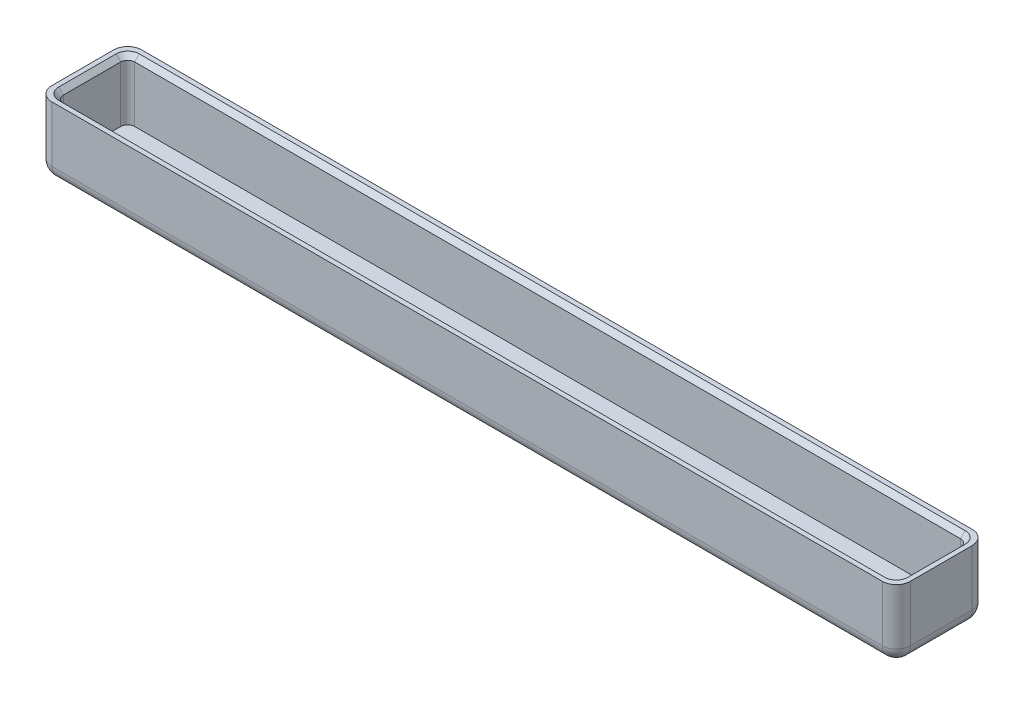
ISO-10303-21;
HEADER;
FILE_DESCRIPTION(('STEP AP214'),'2;1');
FILE_NAME('part.step','',(''),(''),'','','');
FILE_SCHEMA(('AUTOMOTIVE_DESIGN { 1 0 10303 214 1 1 1 1 }'));
ENDSEC;
DATA;
#1=APPLICATION_CONTEXT('core data for automotive mechanical design processes');
#2=APPLICATION_PROTOCOL_DEFINITION('international standard','automotive_design',2000,#1);
#3=PRODUCT_CONTEXT('',#1,'mechanical');
#4=PRODUCT('Part','Part','',(#3));
#5=PRODUCT_RELATED_PRODUCT_CATEGORY('part','',(#4));
#6=PRODUCT_DEFINITION_FORMATION('','',#4);
#7=PRODUCT_DEFINITION_CONTEXT('part definition',#1,'design');
#8=PRODUCT_DEFINITION('design','',#6,#7);
#9=PRODUCT_DEFINITION_SHAPE('','',#8);
#10=(LENGTH_UNIT() NAMED_UNIT(*) SI_UNIT(.MILLI.,.METRE.));
#11=(NAMED_UNIT(*) PLANE_ANGLE_UNIT() SI_UNIT($,.RADIAN.));
#12=(NAMED_UNIT(*) SI_UNIT($,.STERADIAN.) SOLID_ANGLE_UNIT());
#13=UNCERTAINTY_MEASURE_WITH_UNIT(LENGTH_MEASURE(1.E-05),#10,'distance_accuracy_value','');
#14=(GEOMETRIC_REPRESENTATION_CONTEXT(3) GLOBAL_UNCERTAINTY_ASSIGNED_CONTEXT((#13)) GLOBAL_UNIT_ASSIGNED_CONTEXT((#10,
#11,#12)) REPRESENTATION_CONTEXT('',''));
#15=CARTESIAN_POINT('',(0.,0.,0.));
#16=DIRECTION('',(0.,0.,1.));
#17=DIRECTION('',(1.,0.,0.));
#18=AXIS2_PLACEMENT_3D('',#15,#16,#17);
#19=CARTESIAN_POINT('',(0.,15.,0.));
#20=DIRECTION('',(0.,-1.,0.));
#21=DIRECTION('',(0.,0.,-1.));
#22=AXIS2_PLACEMENT_3D('',#19,#20,#21);
#23=PLANE('',#22);
#24=CARTESIAN_POINT('',(88.65,15.,-6.15));
#25=DIRECTION('',(0.,-1.,0.));
#26=DIRECTION('',(0.,0.,-1.));
#27=AXIS2_PLACEMENT_3D('',#24,#25,#26);
#28=CIRCLE('',#27,2.5);
#29=CARTESIAN_POINT('',(88.65,15.,-8.65));
#30=VERTEX_POINT('',#29);
#31=CARTESIAN_POINT('',(91.15,15.,-6.15));
#32=VERTEX_POINT('',#31);
#33=EDGE_CURVE('E327',#30,#32,#28,.T.);
#34=ORIENTED_EDGE('',*,*,#33,.T.);
#35=DIRECTION('',(0.,0.,1.));
#36=VECTOR('',#35,1.);
#37=CARTESIAN_POINT('',(91.15,15.,6.15));
#38=LINE('',#37,#36);
#39=CARTESIAN_POINT('',(91.15,15.,6.15));
#40=VERTEX_POINT('',#39);
#41=EDGE_CURVE('E329',#32,#40,#38,.T.);
#42=ORIENTED_EDGE('',*,*,#41,.T.);
#43=CARTESIAN_POINT('',(88.65,15.,6.15));
#44=DIRECTION('',(0.,-1.,0.));
#45=DIRECTION('',(0.,0.,-1.));
#46=AXIS2_PLACEMENT_3D('',#43,#44,#45);
#47=CIRCLE('',#46,2.5);
#48=CARTESIAN_POINT('',(88.65,15.,8.65));
#49=VERTEX_POINT('',#48);
#50=EDGE_CURVE('E325',#40,#49,#47,.T.);
#51=ORIENTED_EDGE('',*,*,#50,.T.);
#52=DIRECTION('',(-1.,0.,0.));
#53=VECTOR('',#52,1.);
#54=CARTESIAN_POINT('',(-88.65,15.,8.65));
#55=LINE('',#54,#53);
#56=CARTESIAN_POINT('',(-88.65,15.,8.65));
#57=VERTEX_POINT('',#56);
#58=EDGE_CURVE('E321',#49,#57,#55,.T.);
#59=ORIENTED_EDGE('',*,*,#58,.T.);
#60=CARTESIAN_POINT('',(-88.65,15.,6.15));
#61=DIRECTION('',(0.,-1.,0.));
#62=DIRECTION('',(0.,0.,-1.));
#63=AXIS2_PLACEMENT_3D('',#60,#61,#62);
#64=CIRCLE('',#63,2.5);
#65=CARTESIAN_POINT('',(-91.15,15.,6.15));
#66=VERTEX_POINT('',#65);
#67=EDGE_CURVE('E317',#57,#66,#64,.T.);
#68=ORIENTED_EDGE('',*,*,#67,.T.);
#69=DIRECTION('',(0.,0.,-1.));
#70=VECTOR('',#69,1.);
#71=CARTESIAN_POINT('',(-91.15,15.,-6.15));
#72=LINE('',#71,#70);
#73=CARTESIAN_POINT('',(-91.15,15.,-6.15));
#74=VERTEX_POINT('',#73);
#75=EDGE_CURVE('E315',#66,#74,#72,.T.);
#76=ORIENTED_EDGE('',*,*,#75,.T.);
#77=CARTESIAN_POINT('',(-88.65,15.,-6.15));
#78=DIRECTION('',(0.,-1.,0.));
#79=DIRECTION('',(0.,0.,-1.));
#80=AXIS2_PLACEMENT_3D('',#77,#78,#79);
#81=CIRCLE('',#80,2.5);
#82=CARTESIAN_POINT('',(-88.65,15.,-8.65));
#83=VERTEX_POINT('',#82);
#84=EDGE_CURVE('E319',#74,#83,#81,.T.);
#85=ORIENTED_EDGE('',*,*,#84,.T.);
#86=DIRECTION('',(1.,0.,0.));
#87=VECTOR('',#86,1.);
#88=CARTESIAN_POINT('',(88.65,15.,-8.65));
#89=LINE('',#88,#87);
#90=EDGE_CURVE('E323',#83,#30,#89,.T.);
#91=ORIENTED_EDGE('',*,*,#90,.T.);
#92=EDGE_LOOP('',(#34,#42,#51,#59,#68,#76,#85,#91));
#93=FACE_BOUND('',#92,.T.);
#94=DIRECTION('',(1.,0.,0.));
#95=VECTOR('',#94,1.);
#96=CARTESIAN_POINT('',(-92.15,15.,9.65));
#97=LINE('',#96,#95);
#98=CARTESIAN_POINT('',(-89.15,15.,9.65));
#99=VERTEX_POINT('',#98);
#100=CARTESIAN_POINT('',(89.1499999999999,15.,9.65));
#101=VERTEX_POINT('',#100);
#102=EDGE_CURVE('E410',#99,#101,#97,.T.);
#103=ORIENTED_EDGE('',*,*,#102,.T.);
#104=CARTESIAN_POINT('',(89.15,15.,6.65));
#105=DIRECTION('',(0.,-1.,0.));
#106=DIRECTION('',(0.,0.,-1.));
#107=AXIS2_PLACEMENT_3D('',#104,#105,#106);
#108=CIRCLE('',#107,3.);
#109=CARTESIAN_POINT('',(92.15,15.,6.65));
#110=VERTEX_POINT('',#109);
#111=EDGE_CURVE('E200',#101,#110,#108,.F.);
#112=ORIENTED_EDGE('',*,*,#111,.T.);
#113=DIRECTION('',(0.,0.,-1.));
#114=VECTOR('',#113,1.);
#115=CARTESIAN_POINT('',(92.15,15.,9.65));
#116=LINE('',#115,#114);
#117=CARTESIAN_POINT('',(92.15,15.,-6.65));
#118=VERTEX_POINT('',#117);
#119=EDGE_CURVE('E196',#110,#118,#116,.T.);
#120=ORIENTED_EDGE('',*,*,#119,.T.);
#121=CARTESIAN_POINT('',(89.15,15.,-6.65));
#122=DIRECTION('',(0.,-1.,0.));
#123=DIRECTION('',(0.,0.,-1.));
#124=AXIS2_PLACEMENT_3D('',#121,#122,#123);
#125=CIRCLE('',#124,3.);
#126=CARTESIAN_POINT('',(89.1499999999999,15.,-9.65));
#127=VERTEX_POINT('',#126);
#128=EDGE_CURVE('E190',#118,#127,#125,.F.);
#129=ORIENTED_EDGE('',*,*,#128,.T.);
#130=DIRECTION('',(-1.,0.,0.));
#131=VECTOR('',#130,1.);
#132=CARTESIAN_POINT('',(-92.15,15.,-9.65));
#133=LINE('',#132,#131);
#134=CARTESIAN_POINT('',(-89.15,15.,-9.65));
#135=VERTEX_POINT('',#134);
#136=EDGE_CURVE('E193',#127,#135,#133,.T.);
#137=ORIENTED_EDGE('',*,*,#136,.T.);
#138=CARTESIAN_POINT('',(-89.15,15.,-6.65));
#139=DIRECTION('',(0.,-1.,0.));
#140=DIRECTION('',(0.,0.,-1.));
#141=AXIS2_PLACEMENT_3D('',#138,#139,#140);
#142=CIRCLE('',#141,3.);
#143=CARTESIAN_POINT('',(-92.15,15.,-6.65));
#144=VERTEX_POINT('',#143);
#145=EDGE_CURVE('E201',#135,#144,#142,.F.);
#146=ORIENTED_EDGE('',*,*,#145,.T.);
#147=DIRECTION('',(0.,0.,1.));
#148=VECTOR('',#147,1.);
#149=CARTESIAN_POINT('',(-92.15,15.,9.65));
#150=LINE('',#149,#148);
#151=CARTESIAN_POINT('',(-92.15,15.,6.65));
#152=VERTEX_POINT('',#151);
#153=EDGE_CURVE('E210',#144,#152,#150,.T.);
#154=ORIENTED_EDGE('',*,*,#153,.T.);
#155=CARTESIAN_POINT('',(-89.15,15.,6.65));
#156=DIRECTION('',(0.,-1.,0.));
#157=DIRECTION('',(0.,0.,-1.));
#158=AXIS2_PLACEMENT_3D('',#155,#156,#157);
#159=CIRCLE('',#158,3.);
#160=EDGE_CURVE('E248',#152,#99,#159,.F.);
#161=ORIENTED_EDGE('',*,*,#160,.T.);
#162=EDGE_LOOP('',(#103,#112,#120,#129,#137,#146,#154,#161));
#163=FACE_BOUND('',#162,.T.);
#164=ADVANCED_FACE('F37',(#93,#163),#23,.F.);
#165=CARTESIAN_POINT('',(92.15,15.,9.65));
#166=DIRECTION('',(-1.,0.,0.));
#167=DIRECTION('',(0.,0.,1.));
#168=AXIS2_PLACEMENT_3D('',#165,#166,#167);
#169=PLANE('',#168);
#170=ORIENTED_EDGE('',*,*,#119,.F.);
#171=DIRECTION('',(0.,-1.,0.));
#172=VECTOR('',#171,1.);
#173=CARTESIAN_POINT('',(92.15,15.,6.65));
#174=LINE('',#173,#172);
#175=CARTESIAN_POINT('',(92.15,3.,6.65));
#176=VERTEX_POINT('',#175);
#177=EDGE_CURVE('E246',#110,#176,#174,.T.);
#178=ORIENTED_EDGE('',*,*,#177,.T.);
#179=DIRECTION('',(0.,0.,-1.));
#180=VECTOR('',#179,1.);
#181=CARTESIAN_POINT('',(92.15,3.,-9.65));
#182=LINE('',#181,#180);
#183=CARTESIAN_POINT('',(92.15,3.,-6.65));
#184=VERTEX_POINT('',#183);
#185=EDGE_CURVE('E244',#176,#184,#182,.T.);
#186=ORIENTED_EDGE('',*,*,#185,.T.);
#187=DIRECTION('',(0.,-1.,0.));
#188=VECTOR('',#187,1.);
#189=CARTESIAN_POINT('',(92.15,15.,-6.65));
#190=LINE('',#189,#188);
#191=EDGE_CURVE('E242',#184,#118,#190,.F.);
#192=ORIENTED_EDGE('',*,*,#191,.T.);
#193=EDGE_LOOP('',(#170,#178,#186,#192));
#194=FACE_BOUND('',#193,.T.);
#195=ADVANCED_FACE('F424',(#194),#169,.F.);
#196=CARTESIAN_POINT('',(-92.15,15.,-9.65));
#197=DIRECTION('',(0.,0.,1.));
#198=DIRECTION('',(1.,0.,0.));
#199=AXIS2_PLACEMENT_3D('',#196,#197,#198);
#200=PLANE('',#199);
#201=ORIENTED_EDGE('',*,*,#136,.F.);
#202=DIRECTION('',(0.,-1.,0.));
#203=VECTOR('',#202,1.);
#204=CARTESIAN_POINT('',(89.15,15.,-9.65));
#205=LINE('',#204,#203);
#206=CARTESIAN_POINT('',(89.15,3.,-9.65));
#207=VERTEX_POINT('',#206);
#208=EDGE_CURVE('E206',#127,#207,#205,.T.);
#209=ORIENTED_EDGE('',*,*,#208,.T.);
#210=DIRECTION('',(-1.,0.,0.));
#211=VECTOR('',#210,1.);
#212=CARTESIAN_POINT('',(-92.15,3.,-9.65));
#213=LINE('',#212,#211);
#214=CARTESIAN_POINT('',(-89.15,3.,-9.65));
#215=VERTEX_POINT('',#214);
#216=EDGE_CURVE('E217',#207,#215,#213,.T.);
#217=ORIENTED_EDGE('',*,*,#216,.T.);
#218=DIRECTION('',(0.,-1.,0.));
#219=VECTOR('',#218,1.);
#220=CARTESIAN_POINT('',(-89.15,15.,-9.65));
#221=LINE('',#220,#219);
#222=EDGE_CURVE('E209',#215,#135,#221,.F.);
#223=ORIENTED_EDGE('',*,*,#222,.T.);
#224=EDGE_LOOP('',(#201,#209,#217,#223));
#225=FACE_BOUND('',#224,.T.);
#226=ADVANCED_FACE('F204',(#225),#200,.F.);
#227=CARTESIAN_POINT('',(-92.15,15.,9.65));
#228=DIRECTION('',(1.,0.,0.));
#229=DIRECTION('',(0.,0.,-1.));
#230=AXIS2_PLACEMENT_3D('',#227,#228,#229);
#231=PLANE('',#230);
#232=ORIENTED_EDGE('',*,*,#153,.F.);
#233=DIRECTION('',(0.,-1.,0.));
#234=VECTOR('',#233,1.);
#235=CARTESIAN_POINT('',(-92.15,15.,-6.65));
#236=LINE('',#235,#234);
#237=CARTESIAN_POINT('',(-92.15,3.,-6.65));
#238=VERTEX_POINT('',#237);
#239=EDGE_CURVE('E234',#144,#238,#236,.T.);
#240=ORIENTED_EDGE('',*,*,#239,.T.);
#241=DIRECTION('',(0.,0.,1.));
#242=VECTOR('',#241,1.);
#243=CARTESIAN_POINT('',(-92.15,3.,9.65));
#244=LINE('',#243,#242);
#245=CARTESIAN_POINT('',(-92.15,3.,6.65));
#246=VERTEX_POINT('',#245);
#247=EDGE_CURVE('E232',#238,#246,#244,.T.);
#248=ORIENTED_EDGE('',*,*,#247,.T.);
#249=DIRECTION('',(0.,-1.,0.));
#250=VECTOR('',#249,1.);
#251=CARTESIAN_POINT('',(-92.15,15.,6.65));
#252=LINE('',#251,#250);
#253=EDGE_CURVE('E230',#246,#152,#252,.F.);
#254=ORIENTED_EDGE('',*,*,#253,.T.);
#255=EDGE_LOOP('',(#232,#240,#248,#254));
#256=FACE_BOUND('',#255,.T.);
#257=ADVANCED_FACE('F446',(#256),#231,.F.);
#258=CARTESIAN_POINT('',(-92.15,15.,9.65));
#259=DIRECTION('',(0.,0.,-1.));
#260=DIRECTION('',(-1.,0.,0.));
#261=AXIS2_PLACEMENT_3D('',#258,#259,#260);
#262=PLANE('',#261);
#263=DIRECTION('',(1.,0.,0.));
#264=VECTOR('',#263,1.);
#265=CARTESIAN_POINT('',(92.15,3.,9.65));
#266=LINE('',#265,#264);
#267=CARTESIAN_POINT('',(-89.15,3.,9.65));
#268=VERTEX_POINT('',#267);
#269=CARTESIAN_POINT('',(89.15,3.,9.65));
#270=VERTEX_POINT('',#269);
#271=EDGE_CURVE('E238',#268,#270,#266,.T.);
#272=ORIENTED_EDGE('',*,*,#271,.T.);
#273=DIRECTION('',(0.,-1.,0.));
#274=VECTOR('',#273,1.);
#275=CARTESIAN_POINT('',(89.15,15.,9.65));
#276=LINE('',#275,#274);
#277=EDGE_CURVE('E240',#270,#101,#276,.F.);
#278=ORIENTED_EDGE('',*,*,#277,.T.);
#279=ORIENTED_EDGE('',*,*,#102,.F.);
#280=DIRECTION('',(0.,-1.,0.));
#281=VECTOR('',#280,1.);
#282=CARTESIAN_POINT('',(-89.15,15.,9.65));
#283=LINE('',#282,#281);
#284=EDGE_CURVE('E236',#99,#268,#283,.T.);
#285=ORIENTED_EDGE('',*,*,#284,.T.);
#286=EDGE_LOOP('',(#272,#278,#279,#285));
#287=FACE_BOUND('',#286,.T.);
#288=ADVANCED_FACE('F465',(#287),#262,.F.);
#289=CARTESIAN_POINT('',(0.,0.,0.));
#290=DIRECTION('',(0.,-1.,0.));
#291=DIRECTION('',(0.,0.,-1.));
#292=AXIS2_PLACEMENT_3D('',#289,#290,#291);
#293=PLANE('',#292);
#294=DIRECTION('',(0.,0.,1.));
#295=VECTOR('',#294,1.);
#296=CARTESIAN_POINT('',(-89.15,0.,-9.65));
#297=LINE('',#296,#295);
#298=CARTESIAN_POINT('',(-89.15,0.,6.65));
#299=VERTEX_POINT('',#298);
#300=CARTESIAN_POINT('',(-89.15,0.,-6.65));
#301=VERTEX_POINT('',#300);
#302=EDGE_CURVE('E225',#299,#301,#297,.F.);
#303=ORIENTED_EDGE('',*,*,#302,.T.);
#304=DIRECTION('',(-1.,0.,0.));
#305=VECTOR('',#304,1.);
#306=CARTESIAN_POINT('',(92.15,0.,-6.65));
#307=LINE('',#306,#305);
#308=CARTESIAN_POINT('',(89.15,0.,-6.65));
#309=VERTEX_POINT('',#308);
#310=EDGE_CURVE('E227',#301,#309,#307,.F.);
#311=ORIENTED_EDGE('',*,*,#310,.T.);
#312=DIRECTION('',(0.,0.,-1.));
#313=VECTOR('',#312,1.);
#314=CARTESIAN_POINT('',(89.15,0.,9.65));
#315=LINE('',#314,#313);
#316=CARTESIAN_POINT('',(89.15,0.,6.65));
#317=VERTEX_POINT('',#316);
#318=EDGE_CURVE('E216',#309,#317,#315,.F.);
#319=ORIENTED_EDGE('',*,*,#318,.T.);
#320=DIRECTION('',(1.,0.,0.));
#321=VECTOR('',#320,1.);
#322=CARTESIAN_POINT('',(-92.15,0.,6.65));
#323=LINE('',#322,#321);
#324=EDGE_CURVE('E219',#317,#299,#323,.F.);
#325=ORIENTED_EDGE('',*,*,#324,.T.);
#326=EDGE_LOOP('',(#303,#311,#319,#325));
#327=FACE_BOUND('',#326,.T.);
#328=ADVANCED_FACE('F460',(#327),#293,.T.);
#329=CARTESIAN_POINT('',(90.15,15.,9.65));
#330=DIRECTION('',(-1.,0.,0.));
#331=DIRECTION('',(0.,0.,1.));
#332=AXIS2_PLACEMENT_3D('',#329,#330,#331);
#333=PLANE('',#332);
#334=DIRECTION('',(0.,-1.,0.));
#335=VECTOR('',#334,1.);
#336=CARTESIAN_POINT('',(90.15,15.,6.15));
#337=LINE('',#336,#335);
#338=CARTESIAN_POINT('',(90.15,2.,6.15));
#339=VERTEX_POINT('',#338);
#340=CARTESIAN_POINT('',(90.15,14.,6.15));
#341=VERTEX_POINT('',#340);
#342=EDGE_CURVE('E300',#339,#341,#337,.F.);
#343=ORIENTED_EDGE('',*,*,#342,.T.);
#344=DIRECTION('',(0.,0.,-1.));
#345=VECTOR('',#344,1.);
#346=CARTESIAN_POINT('',(90.15,14.,-6.15));
#347=LINE('',#346,#345);
#348=CARTESIAN_POINT('',(90.15,14.,-6.15));
#349=VERTEX_POINT('',#348);
#350=EDGE_CURVE('E312',#341,#349,#347,.T.);
#351=ORIENTED_EDGE('',*,*,#350,.T.);
#352=DIRECTION('',(0.,-1.,0.));
#353=VECTOR('',#352,1.);
#354=CARTESIAN_POINT('',(90.15,2.,-6.15));
#355=LINE('',#354,#353);
#356=CARTESIAN_POINT('',(90.15,2.,-6.15));
#357=VERTEX_POINT('',#356);
#358=EDGE_CURVE('E298',#349,#357,#355,.T.);
#359=ORIENTED_EDGE('',*,*,#358,.T.);
#360=DIRECTION('',(0.,0.,-1.));
#361=VECTOR('',#360,1.);
#362=CARTESIAN_POINT('',(90.15,2.,0.));
#363=LINE('',#362,#361);
#364=EDGE_CURVE('E285',#339,#357,#363,.T.);
#365=ORIENTED_EDGE('',*,*,#364,.F.);
#366=EDGE_LOOP('',(#343,#351,#359,#365));
#367=FACE_BOUND('',#366,.T.);
#368=ADVANCED_FACE('F391',(#367),#333,.T.);
#369=CARTESIAN_POINT('',(-92.15,15.,-7.65));
#370=DIRECTION('',(0.,0.,1.));
#371=DIRECTION('',(1.,0.,0.));
#372=AXIS2_PLACEMENT_3D('',#369,#370,#371);
#373=PLANE('',#372);
#374=DIRECTION('',(0.,-1.,0.));
#375=VECTOR('',#374,1.);
#376=CARTESIAN_POINT('',(88.65,15.,-7.65));
#377=LINE('',#376,#375);
#378=CARTESIAN_POINT('',(88.65,2.,-7.65));
#379=VERTEX_POINT('',#378);
#380=CARTESIAN_POINT('',(88.65,14.,-7.65));
#381=VERTEX_POINT('',#380);
#382=EDGE_CURVE('E305',#379,#381,#377,.F.);
#383=ORIENTED_EDGE('',*,*,#382,.T.);
#384=DIRECTION('',(-1.,0.,0.));
#385=VECTOR('',#384,1.);
#386=CARTESIAN_POINT('',(-88.65,14.,-7.65));
#387=LINE('',#386,#385);
#388=CARTESIAN_POINT('',(-88.65,14.,-7.65));
#389=VERTEX_POINT('',#388);
#390=EDGE_CURVE('E336',#381,#389,#387,.T.);
#391=ORIENTED_EDGE('',*,*,#390,.T.);
#392=DIRECTION('',(0.,-1.,0.));
#393=VECTOR('',#392,1.);
#394=CARTESIAN_POINT('',(-88.65,2.,-7.65));
#395=LINE('',#394,#393);
#396=CARTESIAN_POINT('',(-88.65,2.,-7.65));
#397=VERTEX_POINT('',#396);
#398=EDGE_CURVE('E303',#389,#397,#395,.T.);
#399=ORIENTED_EDGE('',*,*,#398,.T.);
#400=DIRECTION('',(-1.,0.,0.));
#401=VECTOR('',#400,1.);
#402=CARTESIAN_POINT('',(0.,2.,-7.65));
#403=LINE('',#402,#401);
#404=EDGE_CURVE('E396',#379,#397,#403,.T.);
#405=ORIENTED_EDGE('',*,*,#404,.F.);
#406=EDGE_LOOP('',(#383,#391,#399,#405));
#407=FACE_BOUND('',#406,.T.);
#408=ADVANCED_FACE('F493',(#407),#373,.T.);
#409=CARTESIAN_POINT('',(-90.15,15.,9.65));
#410=DIRECTION('',(1.,0.,0.));
#411=DIRECTION('',(0.,0.,-1.));
#412=AXIS2_PLACEMENT_3D('',#409,#410,#411);
#413=PLANE('',#412);
#414=DIRECTION('',(0.,-1.,0.));
#415=VECTOR('',#414,1.);
#416=CARTESIAN_POINT('',(-90.15,15.,-6.15));
#417=LINE('',#416,#415);
#418=CARTESIAN_POINT('',(-90.15,2.,-6.15));
#419=VERTEX_POINT('',#418);
#420=CARTESIAN_POINT('',(-90.15,14.,-6.15));
#421=VERTEX_POINT('',#420);
#422=EDGE_CURVE('E308',#419,#421,#417,.F.);
#423=ORIENTED_EDGE('',*,*,#422,.T.);
#424=DIRECTION('',(0.,0.,1.));
#425=VECTOR('',#424,1.);
#426=CARTESIAN_POINT('',(-90.15,14.,6.15));
#427=LINE('',#426,#425);
#428=CARTESIAN_POINT('',(-90.15,14.,6.15));
#429=VERTEX_POINT('',#428);
#430=EDGE_CURVE('E11',#421,#429,#427,.T.);
#431=ORIENTED_EDGE('',*,*,#430,.T.);
#432=DIRECTION('',(0.,-1.,0.));
#433=VECTOR('',#432,1.);
#434=CARTESIAN_POINT('',(-90.15,2.,6.15));
#435=LINE('',#434,#433);
#436=CARTESIAN_POINT('',(-90.15,2.,6.15));
#437=VERTEX_POINT('',#436);
#438=EDGE_CURVE('E310',#429,#437,#435,.T.);
#439=ORIENTED_EDGE('',*,*,#438,.T.);
#440=DIRECTION('',(0.,0.,1.));
#441=VECTOR('',#440,1.);
#442=CARTESIAN_POINT('',(-90.15,2.,0.));
#443=LINE('',#442,#441);
#444=EDGE_CURVE('E399',#419,#437,#443,.T.);
#445=ORIENTED_EDGE('',*,*,#444,.F.);
#446=EDGE_LOOP('',(#423,#431,#439,#445));
#447=FACE_BOUND('',#446,.T.);
#448=ADVANCED_FACE('F489',(#447),#413,.T.);
#449=CARTESIAN_POINT('',(-92.15,15.,7.65));
#450=DIRECTION('',(0.,0.,-1.));
#451=DIRECTION('',(-1.,0.,0.));
#452=AXIS2_PLACEMENT_3D('',#449,#450,#451);
#453=PLANE('',#452);
#454=DIRECTION('',(0.,-1.,0.));
#455=VECTOR('',#454,1.);
#456=CARTESIAN_POINT('',(-88.65,15.,7.65));
#457=LINE('',#456,#455);
#458=CARTESIAN_POINT('',(-88.65,2.,7.65));
#459=VERTEX_POINT('',#458);
#460=CARTESIAN_POINT('',(-88.65,14.,7.65));
#461=VERTEX_POINT('',#460);
#462=EDGE_CURVE('E252',#459,#461,#457,.F.);
#463=ORIENTED_EDGE('',*,*,#462,.T.);
#464=DIRECTION('',(1.,0.,0.));
#465=VECTOR('',#464,1.);
#466=CARTESIAN_POINT('',(88.65,14.,7.65));
#467=LINE('',#466,#465);
#468=CARTESIAN_POINT('',(88.65,14.,7.65));
#469=VERTEX_POINT('',#468);
#470=EDGE_CURVE('E338',#461,#469,#467,.T.);
#471=ORIENTED_EDGE('',*,*,#470,.T.);
#472=DIRECTION('',(0.,-1.,0.));
#473=VECTOR('',#472,1.);
#474=CARTESIAN_POINT('',(88.65,2.,7.65));
#475=LINE('',#474,#473);
#476=CARTESIAN_POINT('',(88.65,2.,7.65));
#477=VERTEX_POINT('',#476);
#478=EDGE_CURVE('E288',#469,#477,#475,.T.);
#479=ORIENTED_EDGE('',*,*,#478,.T.);
#480=DIRECTION('',(1.,0.,0.));
#481=VECTOR('',#480,1.);
#482=CARTESIAN_POINT('',(0.,2.,7.65));
#483=LINE('',#482,#481);
#484=EDGE_CURVE('E404',#459,#477,#483,.T.);
#485=ORIENTED_EDGE('',*,*,#484,.F.);
#486=EDGE_LOOP('',(#463,#471,#479,#485));
#487=FACE_BOUND('',#486,.T.);
#488=ADVANCED_FACE('F486',(#487),#453,.T.);
#489=CARTESIAN_POINT('',(0.,2.,0.));
#490=DIRECTION('',(0.,-1.,0.));
#491=DIRECTION('',(0.,0.,-1.));
#492=AXIS2_PLACEMENT_3D('',#489,#490,#491);
#493=PLANE('',#492);
#494=ORIENTED_EDGE('',*,*,#484,.T.);
#495=CARTESIAN_POINT('',(88.65,2.,6.15));
#496=DIRECTION('',(0.,-1.,0.));
#497=DIRECTION('',(0.,0.,-1.));
#498=AXIS2_PLACEMENT_3D('',#495,#496,#497);
#499=CIRCLE('',#498,1.5);
#500=EDGE_CURVE('E296',#477,#339,#499,.F.);
#501=ORIENTED_EDGE('',*,*,#500,.T.);
#502=ORIENTED_EDGE('',*,*,#364,.T.);
#503=CARTESIAN_POINT('',(88.65,2.,-6.15));
#504=DIRECTION('',(0.,-1.,0.));
#505=DIRECTION('',(0.,0.,-1.));
#506=AXIS2_PLACEMENT_3D('',#503,#504,#505);
#507=CIRCLE('',#506,1.5);
#508=EDGE_CURVE('E294',#357,#379,#507,.F.);
#509=ORIENTED_EDGE('',*,*,#508,.T.);
#510=ORIENTED_EDGE('',*,*,#404,.T.);
#511=CARTESIAN_POINT('',(-88.65,2.,-6.15));
#512=DIRECTION('',(0.,-1.,0.));
#513=DIRECTION('',(0.,0.,-1.));
#514=AXIS2_PLACEMENT_3D('',#511,#512,#513);
#515=CIRCLE('',#514,1.5);
#516=EDGE_CURVE('E290',#397,#419,#515,.F.);
#517=ORIENTED_EDGE('',*,*,#516,.T.);
#518=ORIENTED_EDGE('',*,*,#444,.T.);
#519=CARTESIAN_POINT('',(-88.65,2.,6.15));
#520=DIRECTION('',(0.,-1.,0.));
#521=DIRECTION('',(0.,0.,-1.));
#522=AXIS2_PLACEMENT_3D('',#519,#520,#521);
#523=CIRCLE('',#522,1.5);
#524=EDGE_CURVE('E292',#437,#459,#523,.F.);
#525=ORIENTED_EDGE('',*,*,#524,.T.);
#526=EDGE_LOOP('',(#494,#501,#502,#509,#510,#517,#518,#525));
#527=FACE_BOUND('',#526,.T.);
#528=ADVANCED_FACE('F483',(#527),#493,.F.);
#529=CARTESIAN_POINT('',(89.15,15.,6.65));
#530=DIRECTION('',(0.,-1.,0.));
#531=DIRECTION('',(0.,0.,-1.));
#532=AXIS2_PLACEMENT_3D('',#529,#530,#531);
#533=CYLINDRICAL_SURFACE('',#532,3.);
#534=ORIENTED_EDGE('',*,*,#111,.F.);
#535=ORIENTED_EDGE('',*,*,#277,.F.);
#536=CARTESIAN_POINT('',(89.15,3.,6.65));
#537=DIRECTION('',(0.,-1.,0.));
#538=DIRECTION('',(0.,0.,-1.));
#539=AXIS2_PLACEMENT_3D('',#536,#537,#538);
#540=CIRCLE('',#539,3.);
#541=EDGE_CURVE('E279',#176,#270,#540,.T.);
#542=ORIENTED_EDGE('',*,*,#541,.F.);
#543=ORIENTED_EDGE('',*,*,#177,.F.);
#544=EDGE_LOOP('',(#534,#535,#542,#543));
#545=FACE_BOUND('',#544,.T.);
#546=ADVANCED_FACE('F419',(#545),#533,.T.);
#547=CARTESIAN_POINT('',(-89.15,15.,6.65));
#548=DIRECTION('',(0.,-1.,0.));
#549=DIRECTION('',(0.,0.,-1.));
#550=AXIS2_PLACEMENT_3D('',#547,#548,#549);
#551=CYLINDRICAL_SURFACE('',#550,3.);
#552=ORIENTED_EDGE('',*,*,#160,.F.);
#553=ORIENTED_EDGE('',*,*,#253,.F.);
#554=CARTESIAN_POINT('',(-89.15,3.,6.65));
#555=DIRECTION('',(0.,-1.,0.));
#556=DIRECTION('',(0.,0.,-1.));
#557=AXIS2_PLACEMENT_3D('',#554,#555,#556);
#558=CIRCLE('',#557,3.);
#559=EDGE_CURVE('E276',#268,#246,#558,.T.);
#560=ORIENTED_EDGE('',*,*,#559,.F.);
#561=ORIENTED_EDGE('',*,*,#284,.F.);
#562=EDGE_LOOP('',(#552,#553,#560,#561));
#563=FACE_BOUND('',#562,.T.);
#564=ADVANCED_FACE('F451',(#563),#551,.T.);
#565=CARTESIAN_POINT('',(-92.15,3.,6.65));
#566=DIRECTION('',(-1.,0.,0.));
#567=DIRECTION('',(0.,0.,1.));
#568=AXIS2_PLACEMENT_3D('',#565,#566,#567);
#569=CYLINDRICAL_SURFACE('',#568,3.);
#570=CARTESIAN_POINT('',(89.15,3.,6.65));
#571=DIRECTION('',(1.,0.,0.));
#572=DIRECTION('',(0.,0.,-1.));
#573=AXIS2_PLACEMENT_3D('',#570,#571,#572);
#574=CIRCLE('',#573,3.);
#575=EDGE_CURVE('E282',#270,#317,#574,.T.);
#576=ORIENTED_EDGE('',*,*,#575,.F.);
#577=ORIENTED_EDGE('',*,*,#271,.F.);
#578=CARTESIAN_POINT('',(-89.15,3.,6.65));
#579=DIRECTION('',(-1.,0.,0.));
#580=DIRECTION('',(0.,0.,1.));
#581=AXIS2_PLACEMENT_3D('',#578,#579,#580);
#582=CIRCLE('',#581,3.);
#583=EDGE_CURVE('E273',#299,#268,#582,.T.);
#584=ORIENTED_EDGE('',*,*,#583,.F.);
#585=ORIENTED_EDGE('',*,*,#324,.F.);
#586=EDGE_LOOP('',(#576,#577,#584,#585));
#587=FACE_BOUND('',#586,.T.);
#588=ADVANCED_FACE('F464',(#587),#569,.T.);
#589=CARTESIAN_POINT('',(89.15,3.,6.65));
#590=DIRECTION('',(0.,0.,1.));
#591=DIRECTION('',(1.,0.,0.));
#592=AXIS2_PLACEMENT_3D('',#589,#590,#591);
#593=SPHERICAL_SURFACE('',#592,3.);
#594=ORIENTED_EDGE('',*,*,#541,.T.);
#595=ORIENTED_EDGE('',*,*,#575,.T.);
#596=CARTESIAN_POINT('',(89.15,3.,6.65));
#597=DIRECTION('',(0.,0.,1.));
#598=DIRECTION('',(1.,0.,0.));
#599=AXIS2_PLACEMENT_3D('',#596,#597,#598);
#600=CIRCLE('',#599,3.);
#601=EDGE_CURVE('E270',#176,#317,#600,.F.);
#602=ORIENTED_EDGE('',*,*,#601,.F.);
#603=EDGE_LOOP('',(#594,#595,#602));
#604=FACE_BOUND('',#603,.T.);
#605=ADVANCED_FACE('F642',(#604),#593,.T.);
#606=CARTESIAN_POINT('',(-89.15,3.,6.65));
#607=DIRECTION('',(0.,0.,1.));
#608=DIRECTION('',(1.,0.,0.));
#609=AXIS2_PLACEMENT_3D('',#606,#607,#608);
#610=SPHERICAL_SURFACE('',#609,3.);
#611=ORIENTED_EDGE('',*,*,#583,.T.);
#612=ORIENTED_EDGE('',*,*,#559,.T.);
#613=CARTESIAN_POINT('',(-89.15,3.,6.65));
#614=DIRECTION('',(0.,0.,1.));
#615=DIRECTION('',(1.,0.,0.));
#616=AXIS2_PLACEMENT_3D('',#613,#614,#615);
#617=CIRCLE('',#616,3.);
#618=EDGE_CURVE('E267',#299,#246,#617,.F.);
#619=ORIENTED_EDGE('',*,*,#618,.F.);
#620=EDGE_LOOP('',(#611,#612,#619));
#621=FACE_BOUND('',#620,.T.);
#622=ADVANCED_FACE('F454',(#621),#610,.T.);
#623=CARTESIAN_POINT('',(89.15,3.,9.65));
#624=DIRECTION('',(0.,0.,1.));
#625=DIRECTION('',(1.,0.,0.));
#626=AXIS2_PLACEMENT_3D('',#623,#624,#625);
#627=CYLINDRICAL_SURFACE('',#626,3.);
#628=ORIENTED_EDGE('',*,*,#601,.T.);
#629=ORIENTED_EDGE('',*,*,#318,.F.);
#630=CARTESIAN_POINT('',(89.15,3.,-6.65));
#631=DIRECTION('',(0.,0.,-1.));
#632=DIRECTION('',(-1.,0.,0.));
#633=AXIS2_PLACEMENT_3D('',#630,#631,#632);
#634=CIRCLE('',#633,3.);
#635=EDGE_CURVE('E264',#184,#309,#634,.T.);
#636=ORIENTED_EDGE('',*,*,#635,.F.);
#637=ORIENTED_EDGE('',*,*,#185,.F.);
#638=EDGE_LOOP('',(#628,#629,#636,#637));
#639=FACE_BOUND('',#638,.T.);
#640=ADVANCED_FACE('F429',(#639),#627,.T.);
#641=CARTESIAN_POINT('',(89.15,15.,-6.65));
#642=DIRECTION('',(0.,-1.,0.));
#643=DIRECTION('',(0.,0.,-1.));
#644=AXIS2_PLACEMENT_3D('',#641,#642,#643);
#645=CYLINDRICAL_SURFACE('',#644,3.);
#646=ORIENTED_EDGE('',*,*,#128,.F.);
#647=ORIENTED_EDGE('',*,*,#191,.F.);
#648=CARTESIAN_POINT('',(89.15,3.,-6.65));
#649=DIRECTION('',(0.,-1.,0.));
#650=DIRECTION('',(0.,0.,-1.));
#651=AXIS2_PLACEMENT_3D('',#648,#649,#650);
#652=CIRCLE('',#651,3.);
#653=EDGE_CURVE('E214',#207,#184,#652,.T.);
#654=ORIENTED_EDGE('',*,*,#653,.F.);
#655=ORIENTED_EDGE('',*,*,#208,.F.);
#656=EDGE_LOOP('',(#646,#647,#654,#655));
#657=FACE_BOUND('',#656,.T.);
#658=ADVANCED_FACE('F212',(#657),#645,.T.);
#659=CARTESIAN_POINT('',(-89.15,15.,-6.65));
#660=DIRECTION('',(0.,-1.,0.));
#661=DIRECTION('',(0.,0.,-1.));
#662=AXIS2_PLACEMENT_3D('',#659,#660,#661);
#663=CYLINDRICAL_SURFACE('',#662,3.);
#664=ORIENTED_EDGE('',*,*,#145,.F.);
#665=ORIENTED_EDGE('',*,*,#222,.F.);
#666=CARTESIAN_POINT('',(-89.15,3.,-6.65));
#667=DIRECTION('',(0.,-1.,0.));
#668=DIRECTION('',(0.,0.,-1.));
#669=AXIS2_PLACEMENT_3D('',#666,#667,#668);
#670=CIRCLE('',#669,3.);
#671=EDGE_CURVE('E260',#238,#215,#670,.T.);
#672=ORIENTED_EDGE('',*,*,#671,.F.);
#673=ORIENTED_EDGE('',*,*,#239,.F.);
#674=EDGE_LOOP('',(#664,#665,#672,#673));
#675=FACE_BOUND('',#674,.T.);
#676=ADVANCED_FACE('F443',(#675),#663,.T.);
#677=CARTESIAN_POINT('',(-89.15,3.,9.65));
#678=DIRECTION('',(0.,0.,-1.));
#679=DIRECTION('',(-1.,0.,0.));
#680=AXIS2_PLACEMENT_3D('',#677,#678,#679);
#681=CYLINDRICAL_SURFACE('',#680,3.);
#682=ORIENTED_EDGE('',*,*,#618,.T.);
#683=ORIENTED_EDGE('',*,*,#247,.F.);
#684=CARTESIAN_POINT('',(-89.15,3.,-6.65));
#685=DIRECTION('',(0.,0.,-1.));
#686=DIRECTION('',(-1.,0.,0.));
#687=AXIS2_PLACEMENT_3D('',#684,#685,#686);
#688=CIRCLE('',#687,3.);
#689=EDGE_CURVE('E257',#301,#238,#688,.T.);
#690=ORIENTED_EDGE('',*,*,#689,.F.);
#691=ORIENTED_EDGE('',*,*,#302,.F.);
#692=EDGE_LOOP('',(#682,#683,#690,#691));
#693=FACE_BOUND('',#692,.T.);
#694=ADVANCED_FACE('F458',(#693),#681,.T.);
#695=CARTESIAN_POINT('',(89.15,3.,-6.65));
#696=DIRECTION('',(0.,0.,1.));
#697=DIRECTION('',(1.,0.,0.));
#698=AXIS2_PLACEMENT_3D('',#695,#696,#697);
#699=SPHERICAL_SURFACE('',#698,3.);
#700=ORIENTED_EDGE('',*,*,#653,.T.);
#701=ORIENTED_EDGE('',*,*,#635,.T.);
#702=CARTESIAN_POINT('',(89.15,3.,-6.65));
#703=DIRECTION('',(1.,0.,0.));
#704=DIRECTION('',(0.,0.,-1.));
#705=AXIS2_PLACEMENT_3D('',#702,#703,#704);
#706=CIRCLE('',#705,3.);
#707=EDGE_CURVE('E255',#207,#309,#706,.F.);
#708=ORIENTED_EDGE('',*,*,#707,.F.);
#709=EDGE_LOOP('',(#700,#701,#708));
#710=FACE_BOUND('',#709,.T.);
#711=ADVANCED_FACE('F431',(#710),#699,.T.);
#712=CARTESIAN_POINT('',(-89.15,3.,-6.65));
#713=DIRECTION('',(0.,0.,1.));
#714=DIRECTION('',(1.,0.,0.));
#715=AXIS2_PLACEMENT_3D('',#712,#713,#714);
#716=SPHERICAL_SURFACE('',#715,3.);
#717=ORIENTED_EDGE('',*,*,#689,.T.);
#718=ORIENTED_EDGE('',*,*,#671,.T.);
#719=CARTESIAN_POINT('',(-89.15,3.,-6.65));
#720=DIRECTION('',(-1.,0.,0.));
#721=DIRECTION('',(0.,0.,1.));
#722=AXIS2_PLACEMENT_3D('',#719,#720,#721);
#723=CIRCLE('',#722,3.);
#724=EDGE_CURVE('E253',#301,#215,#723,.F.);
#725=ORIENTED_EDGE('',*,*,#724,.F.);
#726=EDGE_LOOP('',(#717,#718,#725));
#727=FACE_BOUND('',#726,.T.);
#728=ADVANCED_FACE('F439',(#727),#716,.T.);
#729=CARTESIAN_POINT('',(-92.15,3.,-6.65));
#730=DIRECTION('',(1.,0.,0.));
#731=DIRECTION('',(0.,0.,-1.));
#732=AXIS2_PLACEMENT_3D('',#729,#730,#731);
#733=CYLINDRICAL_SURFACE('',#732,3.);
#734=ORIENTED_EDGE('',*,*,#707,.T.);
#735=ORIENTED_EDGE('',*,*,#310,.F.);
#736=ORIENTED_EDGE('',*,*,#724,.T.);
#737=ORIENTED_EDGE('',*,*,#216,.F.);
#738=EDGE_LOOP('',(#734,#735,#736,#737));
#739=FACE_BOUND('',#738,.T.);
#740=ADVANCED_FACE('F435',(#739),#733,.T.);
#741=CARTESIAN_POINT('',(88.65,15.,6.15));
#742=DIRECTION('',(0.,1.,0.));
#743=DIRECTION('',(0.,0.,1.));
#744=AXIS2_PLACEMENT_3D('',#741,#742,#743);
#745=CYLINDRICAL_SURFACE('',#744,1.5);
#746=ORIENTED_EDGE('',*,*,#478,.F.);
#747=CARTESIAN_POINT('',(88.65,14.,6.15));
#748=DIRECTION('',(0.,-1.,0.));
#749=DIRECTION('',(0.,0.,-1.));
#750=AXIS2_PLACEMENT_3D('',#747,#748,#749);
#751=CIRCLE('',#750,1.5);
#752=EDGE_CURVE('E334',#469,#341,#751,.F.);
#753=ORIENTED_EDGE('',*,*,#752,.T.);
#754=ORIENTED_EDGE('',*,*,#342,.F.);
#755=ORIENTED_EDGE('',*,*,#500,.F.);
#756=EDGE_LOOP('',(#746,#753,#754,#755));
#757=FACE_BOUND('',#756,.T.);
#758=ADVANCED_FACE('F387',(#757),#745,.F.);
#759=CARTESIAN_POINT('',(88.65,15.,-6.15));
#760=DIRECTION('',(0.,1.,0.));
#761=DIRECTION('',(0.,0.,1.));
#762=AXIS2_PLACEMENT_3D('',#759,#760,#761);
#763=CYLINDRICAL_SURFACE('',#762,1.5);
#764=ORIENTED_EDGE('',*,*,#358,.F.);
#765=CARTESIAN_POINT('',(88.65,14.,-6.15));
#766=DIRECTION('',(0.,-1.,0.));
#767=DIRECTION('',(0.,0.,-1.));
#768=AXIS2_PLACEMENT_3D('',#765,#766,#767);
#769=CIRCLE('',#768,1.5);
#770=EDGE_CURVE('E332',#349,#381,#769,.F.);
#771=ORIENTED_EDGE('',*,*,#770,.T.);
#772=ORIENTED_EDGE('',*,*,#382,.F.);
#773=ORIENTED_EDGE('',*,*,#508,.F.);
#774=EDGE_LOOP('',(#764,#771,#772,#773));
#775=FACE_BOUND('',#774,.T.);
#776=ADVANCED_FACE('F517',(#775),#763,.F.);
#777=CARTESIAN_POINT('',(-88.65,15.,6.15));
#778=DIRECTION('',(0.,1.,0.));
#779=DIRECTION('',(0.,0.,1.));
#780=AXIS2_PLACEMENT_3D('',#777,#778,#779);
#781=CYLINDRICAL_SURFACE('',#780,1.5);
#782=ORIENTED_EDGE('',*,*,#438,.F.);
#783=CARTESIAN_POINT('',(-88.65,14.,6.15));
#784=DIRECTION('',(0.,-1.,0.));
#785=DIRECTION('',(0.,0.,-1.));
#786=AXIS2_PLACEMENT_3D('',#783,#784,#785);
#787=CIRCLE('',#786,1.5);
#788=EDGE_CURVE('E47',#429,#461,#787,.F.);
#789=ORIENTED_EDGE('',*,*,#788,.T.);
#790=ORIENTED_EDGE('',*,*,#462,.F.);
#791=ORIENTED_EDGE('',*,*,#524,.F.);
#792=EDGE_LOOP('',(#782,#789,#790,#791));
#793=FACE_BOUND('',#792,.T.);
#794=ADVANCED_FACE('F525',(#793),#781,.F.);
#795=CARTESIAN_POINT('',(-88.65,15.,-6.15));
#796=DIRECTION('',(0.,1.,0.));
#797=DIRECTION('',(0.,0.,1.));
#798=AXIS2_PLACEMENT_3D('',#795,#796,#797);
#799=CYLINDRICAL_SURFACE('',#798,1.5);
#800=ORIENTED_EDGE('',*,*,#398,.F.);
#801=CARTESIAN_POINT('',(-88.65,14.,-6.15));
#802=DIRECTION('',(0.,-1.,0.));
#803=DIRECTION('',(0.,0.,-1.));
#804=AXIS2_PLACEMENT_3D('',#801,#802,#803);
#805=CIRCLE('',#804,1.5);
#806=EDGE_CURVE('E61',#389,#421,#805,.F.);
#807=ORIENTED_EDGE('',*,*,#806,.T.);
#808=ORIENTED_EDGE('',*,*,#422,.F.);
#809=ORIENTED_EDGE('',*,*,#516,.F.);
#810=EDGE_LOOP('',(#800,#807,#808,#809));
#811=FACE_BOUND('',#810,.T.);
#812=ADVANCED_FACE('F533',(#811),#799,.F.);
#813=CARTESIAN_POINT('',(-90.15,14.,9.65));
#814=DIRECTION('',(0.707106781186547,0.707106781186547,0.));
#815=DIRECTION('',(0.,0.,-1.));
#816=AXIS2_PLACEMENT_3D('',#813,#814,#815);
#817=PLANE('',#816);
#818=DIRECTION('',(0.707106781186547,-0.707106781186547,0.));
#819=VECTOR('',#818,1.);
#820=CARTESIAN_POINT('',(-91.15,15.,-6.15));
#821=LINE('',#820,#819);
#822=EDGE_CURVE('E357',#74,#421,#821,.T.);
#823=ORIENTED_EDGE('',*,*,#822,.F.);
#824=ORIENTED_EDGE('',*,*,#75,.F.);
#825=DIRECTION('',(-0.707106781186547,0.707106781186547,0.));
#826=VECTOR('',#825,1.);
#827=CARTESIAN_POINT('',(-90.15,14.,6.15));
#828=LINE('',#827,#826);
#829=EDGE_CURVE('E42',#429,#66,#828,.T.);
#830=ORIENTED_EDGE('',*,*,#829,.F.);
#831=ORIENTED_EDGE('',*,*,#430,.F.);
#832=EDGE_LOOP('',(#823,#824,#830,#831));
#833=FACE_BOUND('',#832,.T.);
#834=ADVANCED_FACE('F40',(#833),#817,.T.);
#835=CARTESIAN_POINT('',(-88.65,15.,6.15));
#836=DIRECTION('',(0.,1.,0.));
#837=DIRECTION('',(0.,0.,1.));
#838=AXIS2_PLACEMENT_3D('',#835,#836,#837);
#839=CONICAL_SURFACE('',#838,2.5,0.785398163397448);
#840=ORIENTED_EDGE('',*,*,#829,.T.);
#841=ORIENTED_EDGE('',*,*,#67,.F.);
#842=DIRECTION('',(0.,0.707106781186547,0.707106781186548));
#843=VECTOR('',#842,1.);
#844=CARTESIAN_POINT('',(-88.65,14.,7.65));
#845=LINE('',#844,#843);
#846=EDGE_CURVE('E355',#461,#57,#845,.T.);
#847=ORIENTED_EDGE('',*,*,#846,.F.);
#848=ORIENTED_EDGE('',*,*,#788,.F.);
#849=EDGE_LOOP('',(#840,#841,#847,#848));
#850=FACE_BOUND('',#849,.T.);
#851=ADVANCED_FACE('F367',(#850),#839,.F.);
#852=CARTESIAN_POINT('',(-88.65,15.,-6.15));
#853=DIRECTION('',(0.,1.,0.));
#854=DIRECTION('',(0.,0.,1.));
#855=AXIS2_PLACEMENT_3D('',#852,#853,#854);
#856=CONICAL_SURFACE('',#855,2.5,0.785398163397449);
#857=ORIENTED_EDGE('',*,*,#822,.T.);
#858=ORIENTED_EDGE('',*,*,#806,.F.);
#859=DIRECTION('',(0.,-0.707106781186547,0.707106781186548));
#860=VECTOR('',#859,1.);
#861=CARTESIAN_POINT('',(-88.65,15.,-8.65));
#862=LINE('',#861,#860);
#863=EDGE_CURVE('E352',#83,#389,#862,.T.);
#864=ORIENTED_EDGE('',*,*,#863,.F.);
#865=ORIENTED_EDGE('',*,*,#84,.F.);
#866=EDGE_LOOP('',(#857,#858,#864,#865));
#867=FACE_BOUND('',#866,.T.);
#868=ADVANCED_FACE('F555',(#867),#856,.F.);
#869=CARTESIAN_POINT('',(-92.15,14.,7.65));
#870=DIRECTION('',(0.,0.707106781186547,-0.707106781186547));
#871=DIRECTION('',(-1.,0.,0.));
#872=AXIS2_PLACEMENT_3D('',#869,#870,#871);
#873=PLANE('',#872);
#874=ORIENTED_EDGE('',*,*,#846,.T.);
#875=ORIENTED_EDGE('',*,*,#58,.F.);
#876=DIRECTION('',(0.,0.707106781186547,0.707106781186547));
#877=VECTOR('',#876,1.);
#878=CARTESIAN_POINT('',(88.65,14.,7.65));
#879=LINE('',#878,#877);
#880=EDGE_CURVE('E349',#469,#49,#879,.T.);
#881=ORIENTED_EDGE('',*,*,#880,.F.);
#882=ORIENTED_EDGE('',*,*,#470,.F.);
#883=EDGE_LOOP('',(#874,#875,#881,#882));
#884=FACE_BOUND('',#883,.T.);
#885=ADVANCED_FACE('F377',(#884),#873,.T.);
#886=CARTESIAN_POINT('',(-92.15,14.,-7.65));
#887=DIRECTION('',(0.,0.707106781186547,0.707106781186547));
#888=DIRECTION('',(1.,0.,0.));
#889=AXIS2_PLACEMENT_3D('',#886,#887,#888);
#890=PLANE('',#889);
#891=ORIENTED_EDGE('',*,*,#863,.T.);
#892=ORIENTED_EDGE('',*,*,#390,.F.);
#893=DIRECTION('',(0.,-0.707106781186547,0.707106781186547));
#894=VECTOR('',#893,1.);
#895=CARTESIAN_POINT('',(88.65,15.,-8.65));
#896=LINE('',#895,#894);
#897=EDGE_CURVE('E346',#30,#381,#896,.T.);
#898=ORIENTED_EDGE('',*,*,#897,.F.);
#899=ORIENTED_EDGE('',*,*,#90,.F.);
#900=EDGE_LOOP('',(#891,#892,#898,#899));
#901=FACE_BOUND('',#900,.T.);
#902=ADVANCED_FACE('F571',(#901),#890,.T.);
#903=CARTESIAN_POINT('',(88.65,15.,6.15));
#904=DIRECTION('',(0.,1.,0.));
#905=DIRECTION('',(0.,0.,1.));
#906=AXIS2_PLACEMENT_3D('',#903,#904,#905);
#907=CONICAL_SURFACE('',#906,2.5,0.785398163397449);
#908=ORIENTED_EDGE('',*,*,#880,.T.);
#909=ORIENTED_EDGE('',*,*,#50,.F.);
#910=DIRECTION('',(0.707106781186547,0.707106781186547,0.));
#911=VECTOR('',#910,1.);
#912=CARTESIAN_POINT('',(90.15,14.,6.15));
#913=LINE('',#912,#911);
#914=EDGE_CURVE('E344',#341,#40,#913,.T.);
#915=ORIENTED_EDGE('',*,*,#914,.F.);
#916=ORIENTED_EDGE('',*,*,#752,.F.);
#917=EDGE_LOOP('',(#908,#909,#915,#916));
#918=FACE_BOUND('',#917,.T.);
#919=ADVANCED_FACE('F381',(#918),#907,.F.);
#920=CARTESIAN_POINT('',(88.65,15.,-6.15));
#921=DIRECTION('',(0.,1.,0.));
#922=DIRECTION('',(0.,0.,1.));
#923=AXIS2_PLACEMENT_3D('',#920,#921,#922);
#924=CONICAL_SURFACE('',#923,2.5,0.785398163397448);
#925=ORIENTED_EDGE('',*,*,#897,.T.);
#926=ORIENTED_EDGE('',*,*,#770,.F.);
#927=DIRECTION('',(-0.707106781186547,-0.707106781186547,0.));
#928=VECTOR('',#927,1.);
#929=CARTESIAN_POINT('',(91.15,15.,-6.15));
#930=LINE('',#929,#928);
#931=EDGE_CURVE('E342',#32,#349,#930,.T.);
#932=ORIENTED_EDGE('',*,*,#931,.F.);
#933=ORIENTED_EDGE('',*,*,#33,.F.);
#934=EDGE_LOOP('',(#925,#926,#932,#933));
#935=FACE_BOUND('',#934,.T.);
#936=ADVANCED_FACE('F589',(#935),#924,.F.);
#937=CARTESIAN_POINT('',(90.15,14.,9.65));
#938=DIRECTION('',(-0.707106781186547,0.707106781186547,0.));
#939=DIRECTION('',(0.,0.,1.));
#940=AXIS2_PLACEMENT_3D('',#937,#938,#939);
#941=PLANE('',#940);
#942=ORIENTED_EDGE('',*,*,#914,.T.);
#943=ORIENTED_EDGE('',*,*,#41,.F.);
#944=ORIENTED_EDGE('',*,*,#931,.T.);
#945=ORIENTED_EDGE('',*,*,#350,.F.);
#946=EDGE_LOOP('',(#942,#943,#944,#945));
#947=FACE_BOUND('',#946,.T.);
#948=ADVANCED_FACE('F598',(#947),#941,.T.);
#949=CLOSED_SHELL('',(#164,#195,#226,#257,#288,#328,#368,#408,#448,#488,#528,#546,#564,#588,
#605,#622,#640,#658,#676,#694,#711,#728,#740,#758,#776,#794,#812,#834,#851,#868,#885,#902,#919,
#936,#948));
#950=MANIFOLD_SOLID_BREP('B2',#949);
#951=ADVANCED_BREP_SHAPE_REPRESENTATION('',(#18,#950),#14);
#952=SHAPE_DEFINITION_REPRESENTATION(#9,#951);
ENDSEC;
END-ISO-10303-21;
